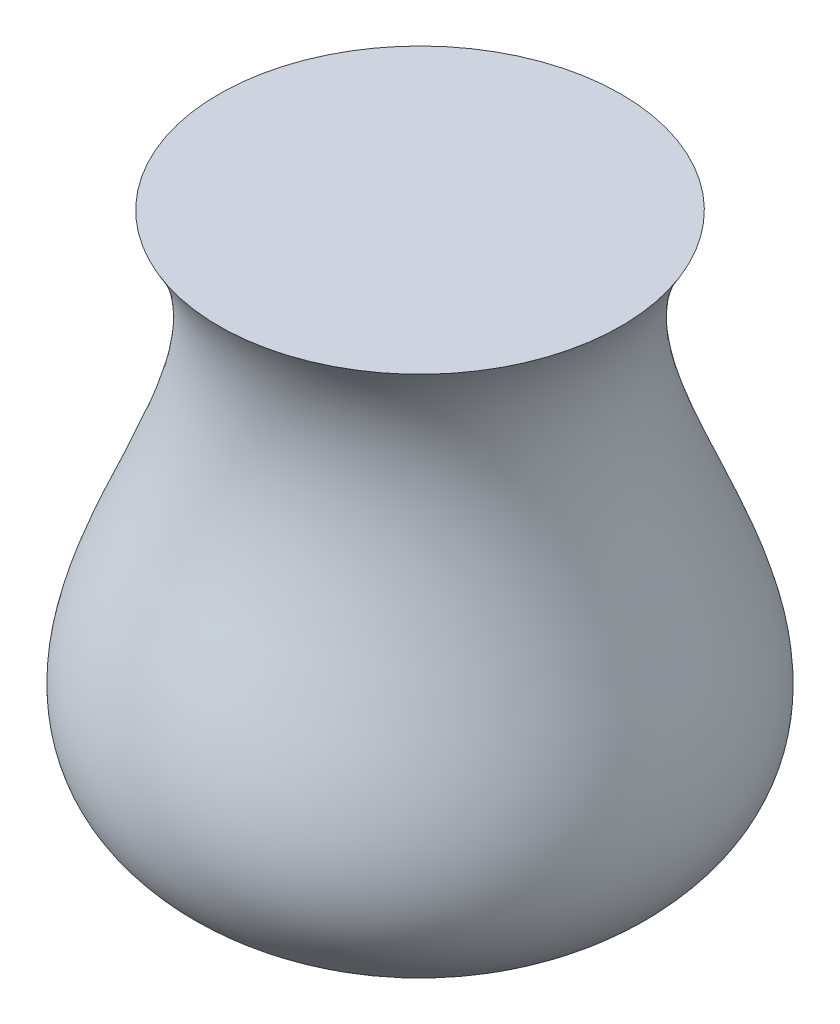
ISO-10303-21;
HEADER;
FILE_DESCRIPTION(('STEP AP214'),'2;1');
FILE_NAME('part.step','',(''),(''),'','','');
FILE_SCHEMA(('AUTOMOTIVE_DESIGN { 1 0 10303 214 1 1 1 1 }'));
ENDSEC;
DATA;
#1=APPLICATION_CONTEXT('core data for automotive mechanical design processes');
#2=APPLICATION_PROTOCOL_DEFINITION('international standard','automotive_design',2000,#1);
#3=PRODUCT_CONTEXT('',#1,'mechanical');
#4=PRODUCT('Part','Part','',(#3));
#5=PRODUCT_RELATED_PRODUCT_CATEGORY('part','',(#4));
#6=PRODUCT_DEFINITION_FORMATION('','',#4);
#7=PRODUCT_DEFINITION_CONTEXT('part definition',#1,'design');
#8=PRODUCT_DEFINITION('design','',#6,#7);
#9=PRODUCT_DEFINITION_SHAPE('','',#8);
#10=(LENGTH_UNIT() NAMED_UNIT(*) SI_UNIT(.MILLI.,.METRE.));
#11=(NAMED_UNIT(*) PLANE_ANGLE_UNIT() SI_UNIT($,.RADIAN.));
#12=(NAMED_UNIT(*) SI_UNIT($,.STERADIAN.) SOLID_ANGLE_UNIT());
#13=UNCERTAINTY_MEASURE_WITH_UNIT(LENGTH_MEASURE(1.E-05),#10,'distance_accuracy_value','');
#14=(GEOMETRIC_REPRESENTATION_CONTEXT(3) GLOBAL_UNCERTAINTY_ASSIGNED_CONTEXT((#13)) GLOBAL_UNIT_ASSIGNED_CONTEXT((#10,
#11,#12)) REPRESENTATION_CONTEXT('',''));
#15=CARTESIAN_POINT('',(0.,0.,0.));
#16=DIRECTION('',(0.,0.,1.));
#17=DIRECTION('',(1.,0.,0.));
#18=AXIS2_PLACEMENT_3D('',#15,#16,#17);
#19=CARTESIAN_POINT('',(1.00000022530097,266.365893381827,0.));
#20=DIRECTION('',(0.,1.,0.));
#21=DIRECTION('',(0.,0.,1.));
#22=AXIS2_PLACEMENT_3D('',#19,#20,#21);
#23=PLANE('',#22);
#24=CARTESIAN_POINT('',(1.00000022530097,266.365893381827,0.));
#25=DIRECTION('',(0.,-1.,0.));
#26=DIRECTION('',(0.,0.,-1.));
#27=AXIS2_PLACEMENT_3D('',#24,#25,#26);
#28=CIRCLE('',#27,95.7002915383051);
#29=CARTESIAN_POINT('',(1.00000022530097,266.365893381827,-95.7002915383051));
#30=VERTEX_POINT('',#29);
#31=EDGE_CURVE('E10',#30,#30,#28,.T.);
#32=ORIENTED_EDGE('',*,*,#31,.F.);
#33=EDGE_LOOP('',(#32));
#34=FACE_BOUND('',#33,.T.);
#35=ADVANCED_FACE('F41',(#34),#23,.T.);
#36=CARTESIAN_POINT('',(66.4225742325772,0.915643791656064,0.));
#37=CARTESIAN_POINT('',(168.682792450977,44.4170613220122,0.));
#38=CARTESIAN_POINT('',(90.8481260790724,140.156944838022,0.));
#39=CARTESIAN_POINT('',(78.5570324768525,238.154218936709,0.));
#40=CARTESIAN_POINT('',(96.7002917636061,266.365893381827,0.));
#41=B_SPLINE_CURVE_WITH_KNOTS('',3,(#36,#37,#38,#39,#40),.UNSPECIFIED.,.F.,.F.,(4,1,4),(0.,
0.626780389570095,0.901320886758748),.UNSPECIFIED.);
#42=CARTESIAN_POINT('',(1.00000022530097,0.915643791656064,0.));
#43=DIRECTION('',(0.,-1.,0.));
#44=AXIS1_PLACEMENT('',#42,#43);
#45=SURFACE_OF_REVOLUTION('',#41,#44);
#46=ORIENTED_EDGE('',*,*,#31,.T.);
#47=EDGE_LOOP('',(#46));
#48=FACE_BOUND('',#47,.T.);
#49=CARTESIAN_POINT('',(1.00000022530097,0.915643791656064,0.));
#50=DIRECTION('',(0.,-1.,0.));
#51=DIRECTION('',(0.,0.,-1.));
#52=AXIS2_PLACEMENT_3D('',#49,#50,#51);
#53=CIRCLE('',#52,65.4225740072762);
#54=CARTESIAN_POINT('',(1.00000022530097,0.915643791656064,-65.4225740072762));
#55=VERTEX_POINT('',#54);
#56=EDGE_CURVE('E48',#55,#55,#53,.T.);
#57=ORIENTED_EDGE('',*,*,#56,.F.);
#58=EDGE_LOOP('',(#57));
#59=FACE_BOUND('',#58,.T.);
#60=ADVANCED_FACE('F62',(#48,#59),#45,.F.);
#61=CARTESIAN_POINT('',(1.00000022530097,0.915643791656064,0.));
#62=DIRECTION('',(0.,-1.,0.));
#63=DIRECTION('',(0.,0.,-1.));
#64=AXIS2_PLACEMENT_3D('',#61,#62,#63);
#65=PLANE('',#64);
#66=ORIENTED_EDGE('',*,*,#56,.T.);
#67=EDGE_LOOP('',(#66));
#68=FACE_BOUND('',#67,.T.);
#69=ADVANCED_FACE('F65',(#68),#65,.T.);
#70=CLOSED_SHELL('',(#35,#60,#69));
#71=MANIFOLD_SOLID_BREP('B2',#70);
#72=ADVANCED_BREP_SHAPE_REPRESENTATION('',(#18,#71),#14);
#73=SHAPE_DEFINITION_REPRESENTATION(#9,#72);
ENDSEC;
END-ISO-10303-21;
